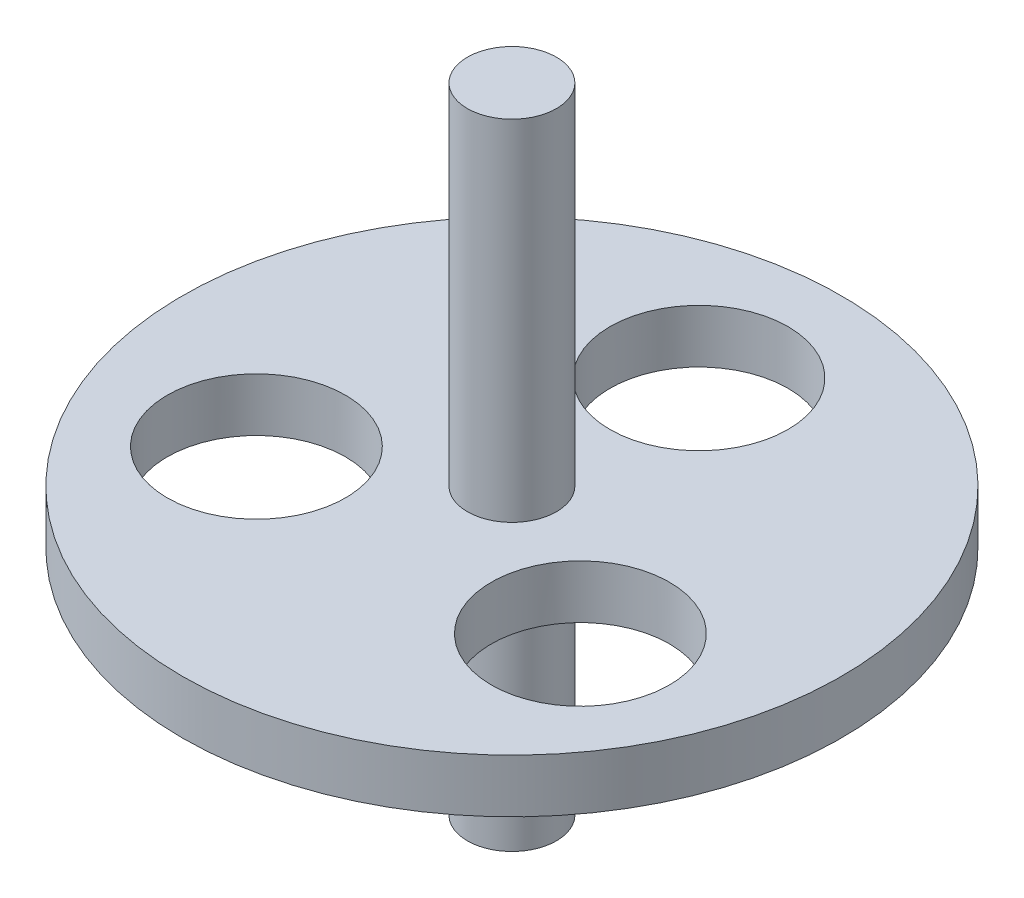
ISO-10303-21;
HEADER;
FILE_DESCRIPTION(('STEP AP214'),'2;1');
FILE_NAME('part.step','',(''),(''),'','','');
FILE_SCHEMA(('AUTOMOTIVE_DESIGN { 1 0 10303 214 1 1 1 1 }'));
ENDSEC;
DATA;
#1=APPLICATION_CONTEXT('core data for automotive mechanical design processes');
#2=APPLICATION_PROTOCOL_DEFINITION('international standard','automotive_design',2000,#1);
#3=PRODUCT_CONTEXT('',#1,'mechanical');
#4=PRODUCT('Part','Part','',(#3));
#5=PRODUCT_RELATED_PRODUCT_CATEGORY('part','',(#4));
#6=PRODUCT_DEFINITION_FORMATION('','',#4);
#7=PRODUCT_DEFINITION_CONTEXT('part definition',#1,'design');
#8=PRODUCT_DEFINITION('design','',#6,#7);
#9=PRODUCT_DEFINITION_SHAPE('','',#8);
#10=(LENGTH_UNIT() NAMED_UNIT(*) SI_UNIT(.MILLI.,.METRE.));
#11=(NAMED_UNIT(*) PLANE_ANGLE_UNIT() SI_UNIT($,.RADIAN.));
#12=(NAMED_UNIT(*) SI_UNIT($,.STERADIAN.) SOLID_ANGLE_UNIT());
#13=UNCERTAINTY_MEASURE_WITH_UNIT(LENGTH_MEASURE(1.E-05),#10,'distance_accuracy_value','');
#14=(GEOMETRIC_REPRESENTATION_CONTEXT(3) GLOBAL_UNCERTAINTY_ASSIGNED_CONTEXT((#13)) GLOBAL_UNIT_ASSIGNED_CONTEXT((#10,
#11,#12)) REPRESENTATION_CONTEXT('',''));
#15=CARTESIAN_POINT('',(0.,0.,0.));
#16=DIRECTION('',(0.,0.,1.));
#17=DIRECTION('',(1.,0.,0.));
#18=AXIS2_PLACEMENT_3D('',#15,#16,#17);
#19=CARTESIAN_POINT('',(0.,3.,0.));
#20=DIRECTION('',(0.,-1.,0.));
#21=DIRECTION('',(0.,0.,-1.));
#22=AXIS2_PLACEMENT_3D('',#19,#20,#21);
#23=CYLINDRICAL_SURFACE('',#22,18.5);
#24=CARTESIAN_POINT('',(0.,3.,0.));
#25=DIRECTION('',(0.,1.,0.));
#26=DIRECTION('',(0.,0.,1.));
#27=AXIS2_PLACEMENT_3D('',#24,#25,#26);
#28=CIRCLE('',#27,18.5);
#29=CARTESIAN_POINT('',(0.,3.,18.5));
#30=VERTEX_POINT('',#29);
#31=EDGE_CURVE('E46',#30,#30,#28,.T.);
#32=ORIENTED_EDGE('',*,*,#31,.F.);
#33=EDGE_LOOP('',(#32));
#34=FACE_BOUND('',#33,.T.);
#35=CARTESIAN_POINT('',(0.,0.,0.));
#36=DIRECTION('',(0.,1.,0.));
#37=DIRECTION('',(0.,0.,1.));
#38=AXIS2_PLACEMENT_3D('',#35,#36,#37);
#39=CIRCLE('',#38,18.5);
#40=CARTESIAN_POINT('',(0.,0.,18.5));
#41=VERTEX_POINT('',#40);
#42=EDGE_CURVE('E50',#41,#41,#39,.T.);
#43=ORIENTED_EDGE('',*,*,#42,.T.);
#44=EDGE_LOOP('',(#43));
#45=FACE_BOUND('',#44,.T.);
#46=ADVANCED_FACE('F40',(#34,#45),#23,.T.);
#47=CARTESIAN_POINT('',(0.,3.,0.));
#48=DIRECTION('',(0.,1.,0.));
#49=DIRECTION('',(0.,0.,1.));
#50=AXIS2_PLACEMENT_3D('',#47,#48,#49);
#51=PLANE('',#50);
#52=CARTESIAN_POINT('',(9.09326673973658,3.,5.25000000000004));
#53=DIRECTION('',(0.,1.,0.));
#54=DIRECTION('',(0.,0.,1.));
#55=AXIS2_PLACEMENT_3D('',#52,#53,#54);
#56=CIRCLE('',#55,5.);
#57=CARTESIAN_POINT('',(9.09326673973658,3.,10.25));
#58=VERTEX_POINT('',#57);
#59=EDGE_CURVE('E78',#58,#58,#56,.F.);
#60=ORIENTED_EDGE('',*,*,#59,.T.);
#61=EDGE_LOOP('',(#60));
#62=FACE_BOUND('',#61,.T.);
#63=CARTESIAN_POINT('',(-9.09326673973665,3.,5.24999999999992));
#64=DIRECTION('',(0.,1.,0.));
#65=DIRECTION('',(0.,0.,1.));
#66=AXIS2_PLACEMENT_3D('',#63,#64,#65);
#67=CIRCLE('',#66,5.);
#68=CARTESIAN_POINT('',(-9.09326673973665,3.,10.2499999999999));
#69=VERTEX_POINT('',#68);
#70=EDGE_CURVE('E72',#69,#69,#67,.F.);
#71=ORIENTED_EDGE('',*,*,#70,.T.);
#72=EDGE_LOOP('',(#71));
#73=FACE_BOUND('',#72,.T.);
#74=CARTESIAN_POINT('',(0.,3.,-10.5));
#75=DIRECTION('',(0.,1.,0.));
#76=DIRECTION('',(0.,0.,1.));
#77=AXIS2_PLACEMENT_3D('',#74,#75,#76);
#78=CIRCLE('',#77,5.);
#79=CARTESIAN_POINT('',(0.,3.,-5.5));
#80=VERTEX_POINT('',#79);
#81=EDGE_CURVE('E66',#80,#80,#78,.F.);
#82=ORIENTED_EDGE('',*,*,#81,.T.);
#83=EDGE_LOOP('',(#82));
#84=FACE_BOUND('',#83,.T.);
#85=CARTESIAN_POINT('',(0.,3.,0.));
#86=DIRECTION('',(0.,1.,0.));
#87=DIRECTION('',(0.,0.,1.));
#88=AXIS2_PLACEMENT_3D('',#85,#86,#87);
#89=CIRCLE('',#88,2.5);
#90=CARTESIAN_POINT('',(0.,3.,2.5));
#91=VERTEX_POINT('',#90);
#92=EDGE_CURVE('E57',#91,#91,#89,.T.);
#93=ORIENTED_EDGE('',*,*,#92,.F.);
#94=EDGE_LOOP('',(#93));
#95=FACE_BOUND('',#94,.T.);
#96=ORIENTED_EDGE('',*,*,#31,.T.);
#97=EDGE_LOOP('',(#96));
#98=FACE_BOUND('',#97,.T.);
#99=ADVANCED_FACE('F90',(#62,#73,#84,#95,#98),#51,.T.);
#100=CARTESIAN_POINT('',(0.,0.,0.));
#101=DIRECTION('',(0.,1.,0.));
#102=DIRECTION('',(0.,0.,1.));
#103=AXIS2_PLACEMENT_3D('',#100,#101,#102);
#104=PLANE('',#103);
#105=CARTESIAN_POINT('',(9.09326673973658,0.,5.25000000000004));
#106=DIRECTION('',(0.,-1.,0.));
#107=DIRECTION('',(0.866025403784436,0.,0.500000000000004));
#108=AXIS2_PLACEMENT_3D('',#105,#106,#107);
#109=CIRCLE('',#108,5.);
#110=CARTESIAN_POINT('',(13.4233937586588,0.,7.75000000000006));
#111=VERTEX_POINT('',#110);
#112=EDGE_CURVE('E69',#111,#111,#109,.T.);
#113=ORIENTED_EDGE('',*,*,#112,.F.);
#114=EDGE_LOOP('',(#113));
#115=FACE_BOUND('',#114,.T.);
#116=CARTESIAN_POINT('',(-9.09326673973665,0.,5.24999999999992));
#117=DIRECTION('',(0.,-1.,0.));
#118=DIRECTION('',(-0.866025403784443,0.,0.499999999999992));
#119=AXIS2_PLACEMENT_3D('',#116,#117,#118);
#120=CIRCLE('',#119,5.);
#121=CARTESIAN_POINT('',(-13.4233937586589,0.,7.74999999999988));
#122=VERTEX_POINT('',#121);
#123=EDGE_CURVE('E75',#122,#122,#120,.T.);
#124=ORIENTED_EDGE('',*,*,#123,.F.);
#125=EDGE_LOOP('',(#124));
#126=FACE_BOUND('',#125,.T.);
#127=CARTESIAN_POINT('',(0.,0.,-10.5));
#128=DIRECTION('',(0.,-1.,0.));
#129=DIRECTION('',(0.,0.,-1.));
#130=AXIS2_PLACEMENT_3D('',#127,#128,#129);
#131=CIRCLE('',#130,5.);
#132=CARTESIAN_POINT('',(0.,0.,-15.5));
#133=VERTEX_POINT('',#132);
#134=EDGE_CURVE('E65',#133,#133,#131,.T.);
#135=ORIENTED_EDGE('',*,*,#134,.F.);
#136=EDGE_LOOP('',(#135));
#137=FACE_BOUND('',#136,.T.);
#138=CARTESIAN_POINT('',(0.,0.,0.));
#139=DIRECTION('',(0.,1.,0.));
#140=DIRECTION('',(0.,0.,1.));
#141=AXIS2_PLACEMENT_3D('',#138,#139,#140);
#142=CIRCLE('',#141,2.5);
#143=CARTESIAN_POINT('',(0.,0.,2.5));
#144=VERTEX_POINT('',#143);
#145=EDGE_CURVE('E10',#144,#144,#142,.F.);
#146=ORIENTED_EDGE('',*,*,#145,.F.);
#147=EDGE_LOOP('',(#146));
#148=FACE_BOUND('',#147,.T.);
#149=ORIENTED_EDGE('',*,*,#42,.F.);
#150=EDGE_LOOP('',(#149));
#151=FACE_BOUND('',#150,.T.);
#152=ADVANCED_FACE('F86',(#115,#126,#137,#148,#151),#104,.F.);
#153=CARTESIAN_POINT('',(0.,22.6,0.));
#154=DIRECTION('',(0.,-1.,0.));
#155=DIRECTION('',(0.,0.,-1.));
#156=AXIS2_PLACEMENT_3D('',#153,#154,#155);
#157=CYLINDRICAL_SURFACE('',#156,2.5);
#158=CARTESIAN_POINT('',(0.,22.6,0.));
#159=DIRECTION('',(0.,1.,0.));
#160=DIRECTION('',(0.,0.,1.));
#161=AXIS2_PLACEMENT_3D('',#158,#159,#160);
#162=CIRCLE('',#161,2.5);
#163=CARTESIAN_POINT('',(0.,22.6,2.5));
#164=VERTEX_POINT('',#163);
#165=EDGE_CURVE('E55',#164,#164,#162,.T.);
#166=ORIENTED_EDGE('',*,*,#165,.F.);
#167=EDGE_LOOP('',(#166));
#168=FACE_BOUND('',#167,.T.);
#169=ORIENTED_EDGE('',*,*,#92,.T.);
#170=EDGE_LOOP('',(#169));
#171=FACE_BOUND('',#170,.T.);
#172=ADVANCED_FACE('F89',(#168,#171),#157,.T.);
#173=CARTESIAN_POINT('',(0.,22.6,0.));
#174=DIRECTION('',(0.,1.,0.));
#175=DIRECTION('',(0.,0.,1.));
#176=AXIS2_PLACEMENT_3D('',#173,#174,#175);
#177=PLANE('',#176);
#178=ORIENTED_EDGE('',*,*,#165,.T.);
#179=EDGE_LOOP('',(#178));
#180=FACE_BOUND('',#179,.T.);
#181=ADVANCED_FACE('F111',(#180),#177,.T.);
#182=CARTESIAN_POINT('',(0.,-13.,0.));
#183=DIRECTION('',(0.,1.,0.));
#184=DIRECTION('',(0.,0.,1.));
#185=AXIS2_PLACEMENT_3D('',#182,#183,#184);
#186=CYLINDRICAL_SURFACE('',#185,2.5);
#187=CARTESIAN_POINT('',(0.,-13.,0.));
#188=DIRECTION('',(0.,-1.,0.));
#189=DIRECTION('',(0.,0.,-1.));
#190=AXIS2_PLACEMENT_3D('',#187,#188,#189);
#191=CIRCLE('',#190,2.5);
#192=CARTESIAN_POINT('',(0.,-13.,2.5));
#193=VERTEX_POINT('',#192);
#194=EDGE_CURVE('E60',#193,#193,#191,.T.);
#195=CARTESIAN_POINT('',(0.,-13.,2.5));
#196=CARTESIAN_POINT('',(0.,-12.8645833333333,2.5));
#197=CARTESIAN_POINT('',(0.,-12.7291666666667,2.5));
#198=CARTESIAN_POINT('',(0.,-12.4583333333333,2.5));
#199=CARTESIAN_POINT('',(0.,-12.3229166666667,2.5));
#200=CARTESIAN_POINT('',(0.,-12.0520833333333,2.5));
#201=CARTESIAN_POINT('',(0.,-11.9166666666667,2.5));
#202=CARTESIAN_POINT('',(0.,-11.6458333333333,2.5));
#203=CARTESIAN_POINT('',(0.,-11.5104166666667,2.5));
#204=CARTESIAN_POINT('',(0.,-11.2395833333333,2.5));
#205=CARTESIAN_POINT('',(0.,-11.1041666666667,2.5));
#206=CARTESIAN_POINT('',(0.,-10.8333333333333,2.5));
#207=CARTESIAN_POINT('',(0.,-10.6979166666667,2.5));
#208=CARTESIAN_POINT('',(0.,-10.4270833333333,2.5));
#209=CARTESIAN_POINT('',(0.,-10.2916666666667,2.5));
#210=CARTESIAN_POINT('',(0.,-10.0208333333333,2.5));
#211=CARTESIAN_POINT('',(0.,-9.88541666666667,2.5));
#212=CARTESIAN_POINT('',(0.,-9.61458333333333,2.5));
#213=CARTESIAN_POINT('',(0.,-9.47916666666667,2.5));
#214=CARTESIAN_POINT('',(0.,-9.20833333333333,2.5));
#215=CARTESIAN_POINT('',(0.,-9.07291666666667,2.5));
#216=CARTESIAN_POINT('',(0.,-8.80208333333333,2.5));
#217=CARTESIAN_POINT('',(0.,-8.66666666666667,2.5));
#218=CARTESIAN_POINT('',(0.,-8.39583333333333,2.5));
#219=CARTESIAN_POINT('',(0.,-8.26041666666667,2.5));
#220=CARTESIAN_POINT('',(0.,-7.98958333333333,2.5));
#221=CARTESIAN_POINT('',(0.,-7.85416666666667,2.5));
#222=CARTESIAN_POINT('',(0.,-7.58333333333333,2.5));
#223=CARTESIAN_POINT('',(0.,-7.44791666666667,2.5));
#224=CARTESIAN_POINT('',(0.,-7.17708333333333,2.5));
#225=CARTESIAN_POINT('',(0.,-7.04166666666667,2.5));
#226=CARTESIAN_POINT('',(0.,-6.77083333333333,2.5));
#227=CARTESIAN_POINT('',(0.,-6.63541666666667,2.5));
#228=CARTESIAN_POINT('',(0.,-6.36458333333333,2.5));
#229=CARTESIAN_POINT('',(0.,-6.22916666666667,2.5));
#230=CARTESIAN_POINT('',(0.,-5.95833333333333,2.5));
#231=CARTESIAN_POINT('',(0.,-5.82291666666667,2.5));
#232=CARTESIAN_POINT('',(0.,-5.55208333333333,2.5));
#233=CARTESIAN_POINT('',(0.,-5.41666666666667,2.5));
#234=CARTESIAN_POINT('',(0.,-5.14583333333333,2.5));
#235=CARTESIAN_POINT('',(0.,-5.01041666666667,2.5));
#236=CARTESIAN_POINT('',(0.,-4.73958333333333,2.5));
#237=CARTESIAN_POINT('',(0.,-4.60416666666667,2.5));
#238=CARTESIAN_POINT('',(0.,-4.33333333333333,2.5));
#239=CARTESIAN_POINT('',(0.,-4.19791666666667,2.5));
#240=CARTESIAN_POINT('',(0.,-3.92708333333333,2.5));
#241=CARTESIAN_POINT('',(0.,-3.79166666666667,2.5));
#242=CARTESIAN_POINT('',(0.,-3.52083333333333,2.5));
#243=CARTESIAN_POINT('',(0.,-3.38541666666667,2.5));
#244=CARTESIAN_POINT('',(0.,-3.11458333333333,2.5));
#245=CARTESIAN_POINT('',(0.,-2.97916666666667,2.5));
#246=CARTESIAN_POINT('',(0.,-2.70833333333333,2.5));
#247=CARTESIAN_POINT('',(0.,-2.57291666666667,2.5));
#248=CARTESIAN_POINT('',(0.,-2.30208333333333,2.5));
#249=CARTESIAN_POINT('',(0.,-2.16666666666667,2.5));
#250=CARTESIAN_POINT('',(0.,-1.89583333333333,2.5));
#251=CARTESIAN_POINT('',(0.,-1.76041666666667,2.5));
#252=CARTESIAN_POINT('',(0.,-1.48958333333333,2.5));
#253=CARTESIAN_POINT('',(0.,-1.35416666666667,2.5));
#254=CARTESIAN_POINT('',(0.,-1.08333333333333,2.5));
#255=CARTESIAN_POINT('',(0.,-0.947916666666667,2.5));
#256=CARTESIAN_POINT('',(0.,-0.677083333333334,2.5));
#257=CARTESIAN_POINT('',(0.,-0.541666666666667,2.5));
#258=CARTESIAN_POINT('',(0.,-0.270833333333334,2.5));
#259=CARTESIAN_POINT('',(0.,-0.135416666666667,2.5));
#260=CARTESIAN_POINT('',(0.,0.,2.5));
#261=B_SPLINE_CURVE_WITH_KNOTS('',3,(#195,#196,#197,#198,#199,#200,#201,#202,#203,#204,#205,
#206,#207,#208,#209,#210,#211,#212,#213,#214,#215,#216,#217,#218,#219,#220,#221,#222,#223,#224,
#225,#226,#227,#228,#229,#230,#231,#232,#233,#234,#235,#236,#237,#238,#239,#240,#241,#242,#243,
#244,#245,#246,#247,#248,#249,#250,#251,#252,#253,#254,#255,#256,#257,#258,#259,#260),
.UNSPECIFIED.,.F.,.F.,(4,2,2,2,2,2,2,2,2,2,2,2,2,2,2,2,2,2,2,2,2,2,2,2,2,2,2,2,2,2,2,2,4),(0.,
0.406249999999999,0.812499999999999,1.21875,1.625,2.03125,2.4375,2.84375,3.25,3.65625,4.0625,
4.46875,4.875,5.28125,5.6875,6.09375,6.5,6.90625,7.3125,7.71875,8.125,8.53125,8.9375,9.34375,
9.75,10.15625,10.5625,10.96875,11.375,11.78125,12.1875,12.59375,13.),.UNSPECIFIED.);
#262=EDGE_CURVE('BSEAM115',#193,#144,#261,.T.);
#263=ORIENTED_EDGE('',*,*,#194,.F.);
#264=ORIENTED_EDGE('',*,*,#145,.T.);
#265=ORIENTED_EDGE('',*,*,#262,.T.);
#266=ORIENTED_EDGE('',*,*,#262,.F.);
#267=EDGE_LOOP('',(#263,#265,#264,#266));
#268=FACE_BOUND('',#267,.T.);
#269=ADVANCED_FACE('F115',(#268),#186,.T.);
#270=CARTESIAN_POINT('',(0.,-13.,0.));
#271=DIRECTION('',(0.,-1.,0.));
#272=DIRECTION('',(0.,0.,-1.));
#273=AXIS2_PLACEMENT_3D('',#270,#271,#272);
#274=PLANE('',#273);
#275=ORIENTED_EDGE('',*,*,#194,.T.);
#276=EDGE_LOOP('',(#275));
#277=FACE_BOUND('',#276,.T.);
#278=ADVANCED_FACE('F119',(#277),#274,.T.);
#279=CARTESIAN_POINT('',(0.,22.601,-10.5));
#280=DIRECTION('',(0.,-1.,0.));
#281=DIRECTION('',(0.,0.,-1.));
#282=AXIS2_PLACEMENT_3D('',#279,#280,#281);
#283=CYLINDRICAL_SURFACE('',#282,5.);
#284=ORIENTED_EDGE('',*,*,#81,.F.);
#285=EDGE_LOOP('',(#284));
#286=FACE_BOUND('',#285,.T.);
#287=ORIENTED_EDGE('',*,*,#134,.T.);
#288=EDGE_LOOP('',(#287));
#289=FACE_BOUND('',#288,.T.);
#290=ADVANCED_FACE('F123',(#286,#289),#283,.F.);
#291=CARTESIAN_POINT('',(-9.09326673973665,22.601,5.24999999999992));
#292=DIRECTION('',(0.,-1.,0.));
#293=DIRECTION('',(0.,0.,-1.));
#294=AXIS2_PLACEMENT_3D('',#291,#292,#293);
#295=CYLINDRICAL_SURFACE('',#294,5.);
#296=ORIENTED_EDGE('',*,*,#70,.F.);
#297=EDGE_LOOP('',(#296));
#298=FACE_BOUND('',#297,.T.);
#299=ORIENTED_EDGE('',*,*,#123,.T.);
#300=EDGE_LOOP('',(#299));
#301=FACE_BOUND('',#300,.T.);
#302=ADVANCED_FACE('F127',(#298,#301),#295,.F.);
#303=CARTESIAN_POINT('',(9.09326673973658,22.601,5.25000000000004));
#304=DIRECTION('',(0.,-1.,0.));
#305=DIRECTION('',(0.,0.,-1.));
#306=AXIS2_PLACEMENT_3D('',#303,#304,#305);
#307=CYLINDRICAL_SURFACE('',#306,5.);
#308=ORIENTED_EDGE('',*,*,#59,.F.);
#309=EDGE_LOOP('',(#308));
#310=FACE_BOUND('',#309,.T.);
#311=ORIENTED_EDGE('',*,*,#112,.T.);
#312=EDGE_LOOP('',(#311));
#313=FACE_BOUND('',#312,.T.);
#314=ADVANCED_FACE('F84',(#310,#313),#307,.F.);
#315=CLOSED_SHELL('',(#46,#99,#152,#172,#181,#269,#278,#290,#302,#314));
#316=MANIFOLD_SOLID_BREP('B2',#315);
#317=ADVANCED_BREP_SHAPE_REPRESENTATION('',(#18,#316),#14);
#318=SHAPE_DEFINITION_REPRESENTATION(#9,#317);
ENDSEC;
END-ISO-10303-21;
